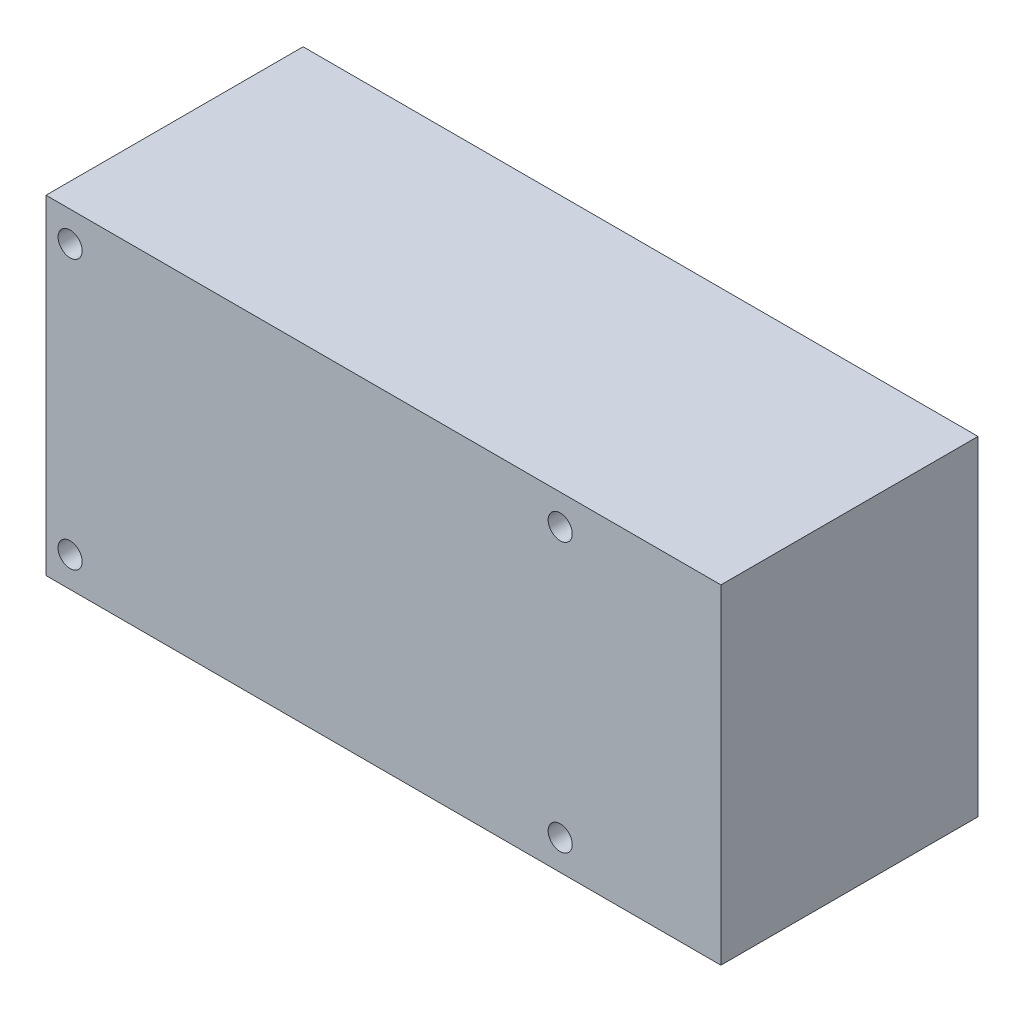
ISO-10303-21;
HEADER;
FILE_DESCRIPTION(('STEP AP214'),'2;1');
FILE_NAME('part.step','',(''),(''),'','','');
FILE_SCHEMA(('AUTOMOTIVE_DESIGN { 1 0 10303 214 1 1 1 1 }'));
ENDSEC;
DATA;
#1=APPLICATION_CONTEXT('core data for automotive mechanical design processes');
#2=APPLICATION_PROTOCOL_DEFINITION('international standard','automotive_design',2000,#1);
#3=PRODUCT_CONTEXT('',#1,'mechanical');
#4=PRODUCT('Part','Part','',(#3));
#5=PRODUCT_RELATED_PRODUCT_CATEGORY('part','',(#4));
#6=PRODUCT_DEFINITION_FORMATION('','',#4);
#7=PRODUCT_DEFINITION_CONTEXT('part definition',#1,'design');
#8=PRODUCT_DEFINITION('design','',#6,#7);
#9=PRODUCT_DEFINITION_SHAPE('','',#8);
#10=(LENGTH_UNIT() NAMED_UNIT(*) SI_UNIT(.MILLI.,.METRE.));
#11=(NAMED_UNIT(*) PLANE_ANGLE_UNIT() SI_UNIT($,.RADIAN.));
#12=(NAMED_UNIT(*) SI_UNIT($,.STERADIAN.) SOLID_ANGLE_UNIT());
#13=UNCERTAINTY_MEASURE_WITH_UNIT(LENGTH_MEASURE(1.E-05),#10,'distance_accuracy_value','');
#14=(GEOMETRIC_REPRESENTATION_CONTEXT(3) GLOBAL_UNCERTAINTY_ASSIGNED_CONTEXT((#13)) GLOBAL_UNIT_ASSIGNED_CONTEXT((#10,
#11,#12)) REPRESENTATION_CONTEXT('',''));
#15=CARTESIAN_POINT('',(0.,0.,0.));
#16=DIRECTION('',(0.,0.,1.));
#17=DIRECTION('',(1.,0.,0.));
#18=AXIS2_PLACEMENT_3D('',#15,#16,#17);
#19=CARTESIAN_POINT('',(0.,0.,32.));
#20=DIRECTION('',(1.,0.,0.));
#21=DIRECTION('',(0.,0.,-1.));
#22=AXIS2_PLACEMENT_3D('',#19,#20,#21);
#23=PLANE('',#22);
#24=DIRECTION('',(0.,-1.,0.));
#25=VECTOR('',#24,1.);
#26=CARTESIAN_POINT('',(0.,0.,0.));
#27=LINE('',#26,#25);
#28=CARTESIAN_POINT('',(0.,41.,0.));
#29=VERTEX_POINT('',#28);
#30=CARTESIAN_POINT('',(0.,0.,0.));
#31=VERTEX_POINT('',#30);
#32=EDGE_CURVE('E98',#29,#31,#27,.T.);
#33=ORIENTED_EDGE('',*,*,#32,.T.);
#34=DIRECTION('',(0.,0.,-1.));
#35=VECTOR('',#34,1.);
#36=CARTESIAN_POINT('',(0.,0.,32.));
#37=LINE('',#36,#35);
#38=CARTESIAN_POINT('',(0.,0.,32.));
#39=VERTEX_POINT('',#38);
#40=EDGE_CURVE('E11',#39,#31,#37,.T.);
#41=ORIENTED_EDGE('',*,*,#40,.F.);
#42=DIRECTION('',(0.,-1.,0.));
#43=VECTOR('',#42,1.);
#44=CARTESIAN_POINT('',(0.,0.,32.));
#45=LINE('',#44,#43);
#46=CARTESIAN_POINT('',(0.,41.,32.));
#47=VERTEX_POINT('',#46);
#48=EDGE_CURVE('E86',#47,#39,#45,.T.);
#49=ORIENTED_EDGE('',*,*,#48,.F.);
#50=DIRECTION('',(0.,0.,-1.));
#51=VECTOR('',#50,1.);
#52=CARTESIAN_POINT('',(0.,41.,32.));
#53=LINE('',#52,#51);
#54=EDGE_CURVE('E94',#47,#29,#53,.T.);
#55=ORIENTED_EDGE('',*,*,#54,.T.);
#56=EDGE_LOOP('',(#33,#41,#49,#55));
#57=FACE_BOUND('',#56,.T.);
#58=ADVANCED_FACE('F35',(#57),#23,.F.);
#59=CARTESIAN_POINT('',(0.,0.,32.));
#60=DIRECTION('',(0.,1.,0.));
#61=DIRECTION('',(0.,0.,1.));
#62=AXIS2_PLACEMENT_3D('',#59,#60,#61);
#63=PLANE('',#62);
#64=DIRECTION('',(1.,0.,0.));
#65=VECTOR('',#64,1.);
#66=CARTESIAN_POINT('',(0.,0.,0.));
#67=LINE('',#66,#65);
#68=CARTESIAN_POINT('',(84.,0.,0.));
#69=VERTEX_POINT('',#68);
#70=EDGE_CURVE('E90',#31,#69,#67,.T.);
#71=ORIENTED_EDGE('',*,*,#70,.T.);
#72=DIRECTION('',(0.,0.,-1.));
#73=VECTOR('',#72,1.);
#74=CARTESIAN_POINT('',(84.,0.,32.));
#75=LINE('',#74,#73);
#76=CARTESIAN_POINT('',(84.,0.,32.));
#77=VERTEX_POINT('',#76);
#78=EDGE_CURVE('E43',#77,#69,#75,.T.);
#79=ORIENTED_EDGE('',*,*,#78,.F.);
#80=DIRECTION('',(1.,0.,0.));
#81=VECTOR('',#80,1.);
#82=CARTESIAN_POINT('',(0.,0.,32.));
#83=LINE('',#82,#81);
#84=EDGE_CURVE('E81',#39,#77,#83,.T.);
#85=ORIENTED_EDGE('',*,*,#84,.F.);
#86=ORIENTED_EDGE('',*,*,#40,.T.);
#87=EDGE_LOOP('',(#71,#79,#85,#86));
#88=FACE_BOUND('',#87,.T.);
#89=ADVANCED_FACE('F89',(#88),#63,.F.);
#90=CARTESIAN_POINT('',(84.,0.,32.));
#91=DIRECTION('',(-1.,0.,0.));
#92=DIRECTION('',(0.,0.,1.));
#93=AXIS2_PLACEMENT_3D('',#90,#91,#92);
#94=PLANE('',#93);
#95=DIRECTION('',(0.,1.,0.));
#96=VECTOR('',#95,1.);
#97=CARTESIAN_POINT('',(84.,0.,0.));
#98=LINE('',#97,#96);
#99=CARTESIAN_POINT('',(84.,41.,0.));
#100=VERTEX_POINT('',#99);
#101=EDGE_CURVE('E68',#69,#100,#98,.T.);
#102=ORIENTED_EDGE('',*,*,#101,.T.);
#103=DIRECTION('',(0.,0.,-1.));
#104=VECTOR('',#103,1.);
#105=CARTESIAN_POINT('',(84.,41.,32.));
#106=LINE('',#105,#104);
#107=CARTESIAN_POINT('',(84.,41.,32.));
#108=VERTEX_POINT('',#107);
#109=EDGE_CURVE('E91',#108,#100,#106,.T.);
#110=ORIENTED_EDGE('',*,*,#109,.F.);
#111=DIRECTION('',(0.,1.,0.));
#112=VECTOR('',#111,1.);
#113=CARTESIAN_POINT('',(84.,0.,32.));
#114=LINE('',#113,#112);
#115=EDGE_CURVE('E84',#77,#108,#114,.T.);
#116=ORIENTED_EDGE('',*,*,#115,.F.);
#117=ORIENTED_EDGE('',*,*,#78,.T.);
#118=EDGE_LOOP('',(#102,#110,#116,#117));
#119=FACE_BOUND('',#118,.T.);
#120=ADVANCED_FACE('F92',(#119),#94,.F.);
#121=CARTESIAN_POINT('',(0.,41.,32.));
#122=DIRECTION('',(0.,-1.,0.));
#123=DIRECTION('',(0.,0.,-1.));
#124=AXIS2_PLACEMENT_3D('',#121,#122,#123);
#125=PLANE('',#124);
#126=DIRECTION('',(-1.,0.,0.));
#127=VECTOR('',#126,1.);
#128=CARTESIAN_POINT('',(0.,41.,0.));
#129=LINE('',#128,#127);
#130=EDGE_CURVE('E74',#100,#29,#129,.T.);
#131=ORIENTED_EDGE('',*,*,#130,.T.);
#132=ORIENTED_EDGE('',*,*,#54,.F.);
#133=DIRECTION('',(-1.,0.,0.));
#134=VECTOR('',#133,1.);
#135=CARTESIAN_POINT('',(0.,41.,32.));
#136=LINE('',#135,#134);
#137=EDGE_CURVE('E51',#108,#47,#136,.T.);
#138=ORIENTED_EDGE('',*,*,#137,.F.);
#139=ORIENTED_EDGE('',*,*,#109,.T.);
#140=EDGE_LOOP('',(#131,#132,#138,#139));
#141=FACE_BOUND('',#140,.T.);
#142=ADVANCED_FACE('F106',(#141),#125,.F.);
#143=CARTESIAN_POINT('',(0.,0.,32.));
#144=DIRECTION('',(0.,0.,-1.));
#145=DIRECTION('',(-1.,0.,0.));
#146=AXIS2_PLACEMENT_3D('',#143,#144,#145);
#147=PLANE('',#146);
#148=CARTESIAN_POINT('',(3.,37.25,32.));
#149=DIRECTION('',(0.,0.,1.));
#150=DIRECTION('',(-1.,0.,0.));
#151=AXIS2_PLACEMENT_3D('',#148,#149,#150);
#152=CIRCLE('',#151,1.5);
#153=CARTESIAN_POINT('',(1.5,37.25,32.));
#154=VERTEX_POINT('',#153);
#155=EDGE_CURVE('E130',#154,#154,#152,.T.);
#156=ORIENTED_EDGE('',*,*,#155,.F.);
#157=EDGE_LOOP('',(#156));
#158=FACE_BOUND('',#157,.T.);
#159=CARTESIAN_POINT('',(63.9999999999999,37.25,32.));
#160=DIRECTION('',(0.,0.,1.));
#161=DIRECTION('',(-1.,0.,0.));
#162=AXIS2_PLACEMENT_3D('',#159,#160,#161);
#163=CIRCLE('',#162,1.5);
#164=CARTESIAN_POINT('',(62.4999999999999,37.25,32.));
#165=VERTEX_POINT('',#164);
#166=EDGE_CURVE('E124',#165,#165,#163,.T.);
#167=ORIENTED_EDGE('',*,*,#166,.F.);
#168=EDGE_LOOP('',(#167));
#169=FACE_BOUND('',#168,.T.);
#170=CARTESIAN_POINT('',(64.,3.75,32.));
#171=DIRECTION('',(0.,0.,1.));
#172=DIRECTION('',(1.,0.,0.));
#173=AXIS2_PLACEMENT_3D('',#170,#171,#172);
#174=CIRCLE('',#173,1.5);
#175=CARTESIAN_POINT('',(65.5,3.75,32.));
#176=VERTEX_POINT('',#175);
#177=EDGE_CURVE('E118',#176,#176,#174,.T.);
#178=ORIENTED_EDGE('',*,*,#177,.F.);
#179=EDGE_LOOP('',(#178));
#180=FACE_BOUND('',#179,.T.);
#181=CARTESIAN_POINT('',(3.,3.75,32.));
#182=DIRECTION('',(0.,0.,1.));
#183=DIRECTION('',(1.,0.,0.));
#184=AXIS2_PLACEMENT_3D('',#181,#182,#183);
#185=CIRCLE('',#184,1.5);
#186=CARTESIAN_POINT('',(4.5,3.75,32.));
#187=VERTEX_POINT('',#186);
#188=EDGE_CURVE('E112',#187,#187,#185,.T.);
#189=ORIENTED_EDGE('',*,*,#188,.F.);
#190=EDGE_LOOP('',(#189));
#191=FACE_BOUND('',#190,.T.);
#192=ORIENTED_EDGE('',*,*,#48,.T.);
#193=ORIENTED_EDGE('',*,*,#84,.T.);
#194=ORIENTED_EDGE('',*,*,#115,.T.);
#195=ORIENTED_EDGE('',*,*,#137,.T.);
#196=EDGE_LOOP('',(#192,#193,#194,#195));
#197=FACE_BOUND('',#196,.T.);
#198=ADVANCED_FACE('F82',(#158,#169,#180,#191,#197),#147,.F.);
#199=CARTESIAN_POINT('',(0.,0.,0.));
#200=DIRECTION('',(0.,0.,-1.));
#201=DIRECTION('',(-1.,0.,0.));
#202=AXIS2_PLACEMENT_3D('',#199,#200,#201);
#203=PLANE('',#202);
#204=CARTESIAN_POINT('',(3.,37.25,0.));
#205=DIRECTION('',(0.,0.,1.));
#206=DIRECTION('',(-1.,0.,0.));
#207=AXIS2_PLACEMENT_3D('',#204,#205,#206);
#208=CIRCLE('',#207,1.5);
#209=CARTESIAN_POINT('',(1.5,37.25,0.));
#210=VERTEX_POINT('',#209);
#211=EDGE_CURVE('E127',#210,#210,#208,.T.);
#212=ORIENTED_EDGE('',*,*,#211,.T.);
#213=EDGE_LOOP('',(#212));
#214=FACE_BOUND('',#213,.T.);
#215=CARTESIAN_POINT('',(63.9999999999999,37.25,0.));
#216=DIRECTION('',(0.,0.,1.));
#217=DIRECTION('',(-1.,0.,0.));
#218=AXIS2_PLACEMENT_3D('',#215,#216,#217);
#219=CIRCLE('',#218,1.5);
#220=CARTESIAN_POINT('',(62.4999999999999,37.25,0.));
#221=VERTEX_POINT('',#220);
#222=EDGE_CURVE('E121',#221,#221,#219,.T.);
#223=ORIENTED_EDGE('',*,*,#222,.T.);
#224=EDGE_LOOP('',(#223));
#225=FACE_BOUND('',#224,.T.);
#226=CARTESIAN_POINT('',(64.,3.75,0.));
#227=DIRECTION('',(0.,0.,1.));
#228=DIRECTION('',(1.,0.,0.));
#229=AXIS2_PLACEMENT_3D('',#226,#227,#228);
#230=CIRCLE('',#229,1.5);
#231=CARTESIAN_POINT('',(65.5,3.75,0.));
#232=VERTEX_POINT('',#231);
#233=EDGE_CURVE('E115',#232,#232,#230,.T.);
#234=ORIENTED_EDGE('',*,*,#233,.T.);
#235=EDGE_LOOP('',(#234));
#236=FACE_BOUND('',#235,.T.);
#237=CARTESIAN_POINT('',(3.,3.75,0.));
#238=DIRECTION('',(0.,0.,1.));
#239=DIRECTION('',(1.,0.,0.));
#240=AXIS2_PLACEMENT_3D('',#237,#238,#239);
#241=CIRCLE('',#240,1.5);
#242=CARTESIAN_POINT('',(4.5,3.75,0.));
#243=VERTEX_POINT('',#242);
#244=EDGE_CURVE('E101',#243,#243,#241,.T.);
#245=ORIENTED_EDGE('',*,*,#244,.T.);
#246=EDGE_LOOP('',(#245));
#247=FACE_BOUND('',#246,.T.);
#248=ORIENTED_EDGE('',*,*,#32,.F.);
#249=ORIENTED_EDGE('',*,*,#130,.F.);
#250=ORIENTED_EDGE('',*,*,#101,.F.);
#251=ORIENTED_EDGE('',*,*,#70,.F.);
#252=EDGE_LOOP('',(#248,#249,#250,#251));
#253=FACE_BOUND('',#252,.T.);
#254=ADVANCED_FACE('F109',(#214,#225,#236,#247,#253),#203,.T.);
#255=CARTESIAN_POINT('',(3.,3.75,0.));
#256=DIRECTION('',(0.,0.,1.));
#257=DIRECTION('',(1.,0.,0.));
#258=AXIS2_PLACEMENT_3D('',#255,#256,#257);
#259=CYLINDRICAL_SURFACE('',#258,1.5);
#260=ORIENTED_EDGE('',*,*,#244,.F.);
#261=EDGE_LOOP('',(#260));
#262=FACE_BOUND('',#261,.T.);
#263=ORIENTED_EDGE('',*,*,#188,.T.);
#264=EDGE_LOOP('',(#263));
#265=FACE_BOUND('',#264,.T.);
#266=ADVANCED_FACE('F154',(#262,#265),#259,.F.);
#267=CARTESIAN_POINT('',(64.,3.75,0.));
#268=DIRECTION('',(0.,0.,1.));
#269=DIRECTION('',(1.,0.,0.));
#270=AXIS2_PLACEMENT_3D('',#267,#268,#269);
#271=CYLINDRICAL_SURFACE('',#270,1.5);
#272=ORIENTED_EDGE('',*,*,#233,.F.);
#273=EDGE_LOOP('',(#272));
#274=FACE_BOUND('',#273,.T.);
#275=ORIENTED_EDGE('',*,*,#177,.T.);
#276=EDGE_LOOP('',(#275));
#277=FACE_BOUND('',#276,.T.);
#278=ADVANCED_FACE('F156',(#274,#277),#271,.F.);
#279=CARTESIAN_POINT('',(63.9999999999999,37.25,0.));
#280=DIRECTION('',(0.,0.,1.));
#281=DIRECTION('',(1.,0.,0.));
#282=AXIS2_PLACEMENT_3D('',#279,#280,#281);
#283=CYLINDRICAL_SURFACE('',#282,1.5);
#284=ORIENTED_EDGE('',*,*,#222,.F.);
#285=EDGE_LOOP('',(#284));
#286=FACE_BOUND('',#285,.T.);
#287=ORIENTED_EDGE('',*,*,#166,.T.);
#288=EDGE_LOOP('',(#287));
#289=FACE_BOUND('',#288,.T.);
#290=ADVANCED_FACE('F141',(#286,#289),#283,.F.);
#291=CARTESIAN_POINT('',(3.,37.25,0.));
#292=DIRECTION('',(0.,0.,1.));
#293=DIRECTION('',(1.,0.,0.));
#294=AXIS2_PLACEMENT_3D('',#291,#292,#293);
#295=CYLINDRICAL_SURFACE('',#294,1.5);
#296=ORIENTED_EDGE('',*,*,#211,.F.);
#297=EDGE_LOOP('',(#296));
#298=FACE_BOUND('',#297,.T.);
#299=ORIENTED_EDGE('',*,*,#155,.T.);
#300=EDGE_LOOP('',(#299));
#301=FACE_BOUND('',#300,.T.);
#302=ADVANCED_FACE('F138',(#298,#301),#295,.F.);
#303=CLOSED_SHELL('',(#58,#89,#120,#142,#198,#254,#266,#278,#290,#302));
#304=MANIFOLD_SOLID_BREP('B2',#303);
#305=ADVANCED_BREP_SHAPE_REPRESENTATION('',(#18,#304),#14);
#306=SHAPE_DEFINITION_REPRESENTATION(#9,#305);
ENDSEC;
END-ISO-10303-21;
